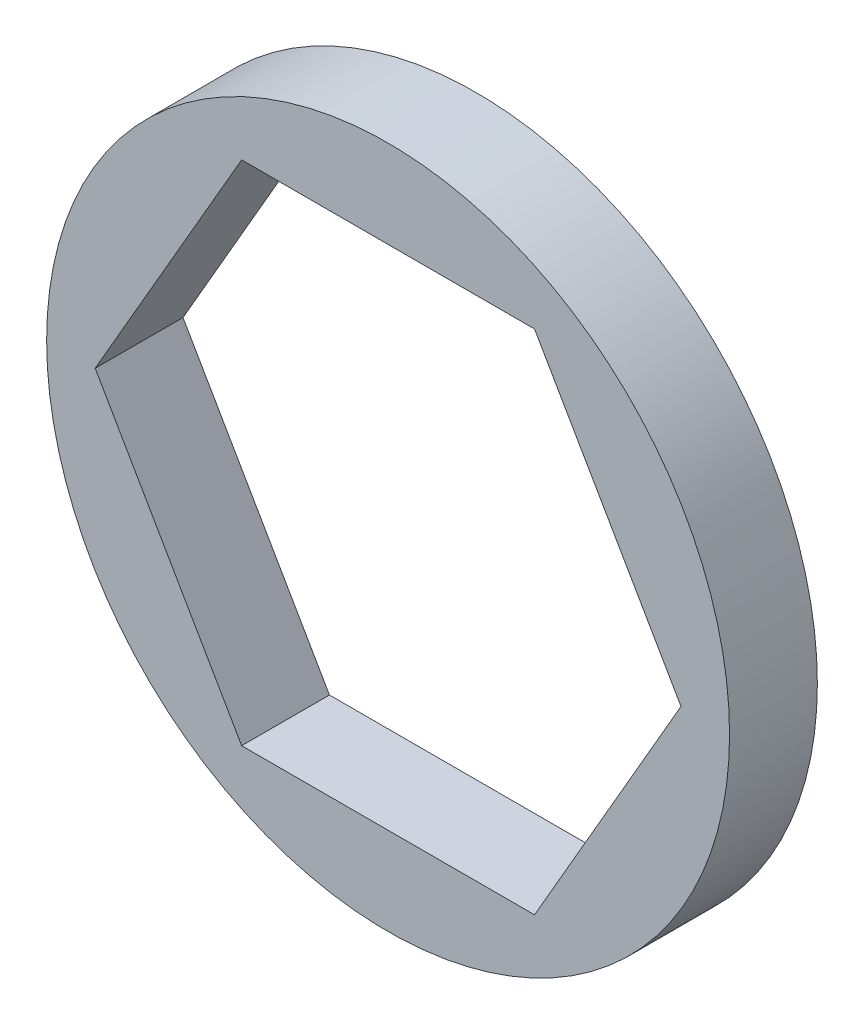
ISO-10303-21;
HEADER;
FILE_DESCRIPTION(('STEP AP214'),'2;1');
FILE_NAME('part.step','',(''),(''),'','','');
FILE_SCHEMA(('AUTOMOTIVE_DESIGN { 1 0 10303 214 1 1 1 1 }'));
ENDSEC;
DATA;
#1=APPLICATION_CONTEXT('core data for automotive mechanical design processes');
#2=APPLICATION_PROTOCOL_DEFINITION('international standard','automotive_design',2000,#1);
#3=PRODUCT_CONTEXT('',#1,'mechanical');
#4=PRODUCT('Part','Part','',(#3));
#5=PRODUCT_RELATED_PRODUCT_CATEGORY('part','',(#4));
#6=PRODUCT_DEFINITION_FORMATION('','',#4);
#7=PRODUCT_DEFINITION_CONTEXT('part definition',#1,'design');
#8=PRODUCT_DEFINITION('design','',#6,#7);
#9=PRODUCT_DEFINITION_SHAPE('','',#8);
#10=(LENGTH_UNIT() NAMED_UNIT(*) SI_UNIT(.MILLI.,.METRE.));
#11=(NAMED_UNIT(*) PLANE_ANGLE_UNIT() SI_UNIT($,.RADIAN.));
#12=(NAMED_UNIT(*) SI_UNIT($,.STERADIAN.) SOLID_ANGLE_UNIT());
#13=UNCERTAINTY_MEASURE_WITH_UNIT(LENGTH_MEASURE(1.E-05),#10,'distance_accuracy_value','');
#14=(GEOMETRIC_REPRESENTATION_CONTEXT(3) GLOBAL_UNCERTAINTY_ASSIGNED_CONTEXT((#13)) GLOBAL_UNIT_ASSIGNED_CONTEXT((#10,
#11,#12)) REPRESENTATION_CONTEXT('',''));
#15=CARTESIAN_POINT('',(0.,0.,0.));
#16=DIRECTION('',(0.,0.,1.));
#17=DIRECTION('',(1.,0.,0.));
#18=AXIS2_PLACEMENT_3D('',#15,#16,#17);
#19=CARTESIAN_POINT('',(0.,0.,2.286));
#20=DIRECTION('',(0.,0.,1.));
#21=DIRECTION('',(1.,0.,0.));
#22=AXIS2_PLACEMENT_3D('',#19,#20,#21);
#23=PLANE('',#22);
#24=CARTESIAN_POINT('',(0.,0.,2.286));
#25=DIRECTION('',(0.,0.,1.));
#26=DIRECTION('',(1.,0.,0.));
#27=AXIS2_PLACEMENT_3D('',#24,#25,#26);
#28=CIRCLE('',#27,8.89);
#29=CARTESIAN_POINT('',(8.89,0.,2.286));
#30=VERTEX_POINT('',#29);
#31=EDGE_CURVE('E11',#30,#30,#28,.T.);
#32=ORIENTED_EDGE('',*,*,#31,.T.);
#33=EDGE_LOOP('',(#32));
#34=FACE_BOUND('',#33,.T.);
#35=DIRECTION('',(-0.5,0.866025403784439,0.));
#36=VECTOR('',#35,1.);
#37=CARTESIAN_POINT('',(7.62564235545658,0.,2.286));
#38=LINE('',#37,#36);
#39=CARTESIAN_POINT('',(7.62564235545658,0.,2.286));
#40=VERTEX_POINT('',#39);
#41=CARTESIAN_POINT('',(3.81282117772829,6.604,2.286));
#42=VERTEX_POINT('',#41);
#43=EDGE_CURVE('E101',#40,#42,#38,.T.);
#44=ORIENTED_EDGE('',*,*,#43,.F.);
#45=DIRECTION('',(0.5,0.866025403784439,0.));
#46=VECTOR('',#45,1.);
#47=CARTESIAN_POINT('',(3.81282117772829,-6.604,2.286));
#48=LINE('',#47,#46);
#49=CARTESIAN_POINT('',(3.81282117772829,-6.604,2.286));
#50=VERTEX_POINT('',#49);
#51=EDGE_CURVE('E93',#50,#40,#48,.T.);
#52=ORIENTED_EDGE('',*,*,#51,.F.);
#53=DIRECTION('',(1.,0.,0.));
#54=VECTOR('',#53,1.);
#55=CARTESIAN_POINT('',(-3.81282117772829,-6.604,2.286));
#56=LINE('',#55,#54);
#57=CARTESIAN_POINT('',(-3.81282117772829,-6.604,2.286));
#58=VERTEX_POINT('',#57);
#59=EDGE_CURVE('E121',#58,#50,#56,.T.);
#60=ORIENTED_EDGE('',*,*,#59,.F.);
#61=DIRECTION('',(0.5,-0.866025403784439,0.));
#62=VECTOR('',#61,1.);
#63=CARTESIAN_POINT('',(-7.62564235545658,0.,2.286));
#64=LINE('',#63,#62);
#65=CARTESIAN_POINT('',(-7.62564235545658,0.,2.286));
#66=VERTEX_POINT('',#65);
#67=EDGE_CURVE('E119',#66,#58,#64,.T.);
#68=ORIENTED_EDGE('',*,*,#67,.F.);
#69=DIRECTION('',(-0.5,-0.866025403784439,0.));
#70=VECTOR('',#69,1.);
#71=CARTESIAN_POINT('',(-3.81282117772829,6.604,2.286));
#72=LINE('',#71,#70);
#73=CARTESIAN_POINT('',(-3.81282117772829,6.604,2.286));
#74=VERTEX_POINT('',#73);
#75=EDGE_CURVE('E115',#74,#66,#72,.T.);
#76=ORIENTED_EDGE('',*,*,#75,.F.);
#77=DIRECTION('',(-1.,0.,0.));
#78=VECTOR('',#77,1.);
#79=CARTESIAN_POINT('',(3.81282117772829,6.604,2.286));
#80=LINE('',#79,#78);
#81=EDGE_CURVE('E113',#42,#74,#80,.T.);
#82=ORIENTED_EDGE('',*,*,#81,.F.);
#83=EDGE_LOOP('',(#44,#52,#60,#68,#76,#82));
#84=FACE_BOUND('',#83,.T.);
#85=ADVANCED_FACE('F40',(#34,#84),#23,.T.);
#86=CARTESIAN_POINT('',(0.,0.,0.));
#87=DIRECTION('',(0.,0.,1.));
#88=DIRECTION('',(1.,0.,0.));
#89=AXIS2_PLACEMENT_3D('',#86,#87,#88);
#90=PLANE('',#89);
#91=CARTESIAN_POINT('',(0.,0.,0.));
#92=DIRECTION('',(0.,0.,1.));
#93=DIRECTION('',(1.,0.,0.));
#94=AXIS2_PLACEMENT_3D('',#91,#92,#93);
#95=CIRCLE('',#94,8.89);
#96=CARTESIAN_POINT('',(8.89,0.,0.));
#97=VERTEX_POINT('',#96);
#98=EDGE_CURVE('E44',#97,#97,#95,.T.);
#99=ORIENTED_EDGE('',*,*,#98,.F.);
#100=EDGE_LOOP('',(#99));
#101=FACE_BOUND('',#100,.T.);
#102=DIRECTION('',(0.5,0.866025403784439,0.));
#103=VECTOR('',#102,1.);
#104=CARTESIAN_POINT('',(3.81282117772829,-6.604,0.));
#105=LINE('',#104,#103);
#106=CARTESIAN_POINT('',(3.81282117772829,-6.604,0.));
#107=VERTEX_POINT('',#106);
#108=CARTESIAN_POINT('',(7.62564235545658,0.,0.));
#109=VERTEX_POINT('',#108);
#110=EDGE_CURVE('E63',#107,#109,#105,.T.);
#111=ORIENTED_EDGE('',*,*,#110,.T.);
#112=DIRECTION('',(-0.5,0.866025403784439,0.));
#113=VECTOR('',#112,1.);
#114=CARTESIAN_POINT('',(7.62564235545658,0.,0.));
#115=LINE('',#114,#113);
#116=CARTESIAN_POINT('',(3.81282117772829,6.604,0.));
#117=VERTEX_POINT('',#116);
#118=EDGE_CURVE('E108',#109,#117,#115,.T.);
#119=ORIENTED_EDGE('',*,*,#118,.T.);
#120=DIRECTION('',(-1.,0.,0.));
#121=VECTOR('',#120,1.);
#122=CARTESIAN_POINT('',(3.81282117772829,6.604,0.));
#123=LINE('',#122,#121);
#124=CARTESIAN_POINT('',(-3.81282117772829,6.604,0.));
#125=VERTEX_POINT('',#124);
#126=EDGE_CURVE('E125',#117,#125,#123,.T.);
#127=ORIENTED_EDGE('',*,*,#126,.T.);
#128=DIRECTION('',(-0.5,-0.866025403784439,0.));
#129=VECTOR('',#128,1.);
#130=CARTESIAN_POINT('',(-3.81282117772829,6.604,0.));
#131=LINE('',#130,#129);
#132=CARTESIAN_POINT('',(-7.62564235545658,0.,0.));
#133=VERTEX_POINT('',#132);
#134=EDGE_CURVE('E128',#125,#133,#131,.T.);
#135=ORIENTED_EDGE('',*,*,#134,.T.);
#136=DIRECTION('',(0.5,-0.866025403784439,0.));
#137=VECTOR('',#136,1.);
#138=CARTESIAN_POINT('',(-7.62564235545658,0.,0.));
#139=LINE('',#138,#137);
#140=CARTESIAN_POINT('',(-3.81282117772829,-6.604,0.));
#141=VERTEX_POINT('',#140);
#142=EDGE_CURVE('E131',#133,#141,#139,.T.);
#143=ORIENTED_EDGE('',*,*,#142,.T.);
#144=DIRECTION('',(1.,0.,0.));
#145=VECTOR('',#144,1.);
#146=CARTESIAN_POINT('',(-3.81282117772829,-6.604,0.));
#147=LINE('',#146,#145);
#148=EDGE_CURVE('E102',#141,#107,#147,.T.);
#149=ORIENTED_EDGE('',*,*,#148,.T.);
#150=EDGE_LOOP('',(#111,#119,#127,#135,#143,#149));
#151=FACE_BOUND('',#150,.T.);
#152=ADVANCED_FACE('F148',(#101,#151),#90,.F.);
#153=CARTESIAN_POINT('',(0.,0.,2.286));
#154=DIRECTION('',(0.,0.,-1.));
#155=DIRECTION('',(-1.,0.,0.));
#156=AXIS2_PLACEMENT_3D('',#153,#154,#155);
#157=CYLINDRICAL_SURFACE('',#156,8.89);
#158=ORIENTED_EDGE('',*,*,#31,.F.);
#159=EDGE_LOOP('',(#158));
#160=FACE_BOUND('',#159,.T.);
#161=ORIENTED_EDGE('',*,*,#98,.T.);
#162=EDGE_LOOP('',(#161));
#163=FACE_BOUND('',#162,.T.);
#164=ADVANCED_FACE('F42',(#160,#163),#157,.T.);
#165=CARTESIAN_POINT('',(3.81282117772829,-6.604,2.286));
#166=DIRECTION('',(-0.866025403784439,0.5,0.));
#167=DIRECTION('',(-0.5,-0.866025403784439,0.));
#168=AXIS2_PLACEMENT_3D('',#165,#166,#167);
#169=PLANE('',#168);
#170=ORIENTED_EDGE('',*,*,#110,.F.);
#171=DIRECTION('',(0.,0.,-1.));
#172=VECTOR('',#171,1.);
#173=CARTESIAN_POINT('',(3.81282117772829,-6.604,2.286));
#174=LINE('',#173,#172);
#175=EDGE_CURVE('E97',#50,#107,#174,.T.);
#176=ORIENTED_EDGE('',*,*,#175,.F.);
#177=ORIENTED_EDGE('',*,*,#51,.T.);
#178=DIRECTION('',(0.,0.,-1.));
#179=VECTOR('',#178,1.);
#180=CARTESIAN_POINT('',(7.62564235545658,0.,2.286));
#181=LINE('',#180,#179);
#182=EDGE_CURVE('E96',#40,#109,#181,.T.);
#183=ORIENTED_EDGE('',*,*,#182,.T.);
#184=EDGE_LOOP('',(#170,#176,#177,#183));
#185=FACE_BOUND('',#184,.T.);
#186=ADVANCED_FACE('F95',(#185),#169,.T.);
#187=CARTESIAN_POINT('',(7.62564235545658,0.,2.286));
#188=DIRECTION('',(-0.866025403784438,-0.5,0.));
#189=DIRECTION('',(0.5,-0.866025403784439,0.));
#190=AXIS2_PLACEMENT_3D('',#187,#188,#189);
#191=PLANE('',#190);
#192=ORIENTED_EDGE('',*,*,#118,.F.);
#193=ORIENTED_EDGE('',*,*,#182,.F.);
#194=ORIENTED_EDGE('',*,*,#43,.T.);
#195=DIRECTION('',(0.,0.,-1.));
#196=VECTOR('',#195,1.);
#197=CARTESIAN_POINT('',(3.81282117772829,6.604,2.286));
#198=LINE('',#197,#196);
#199=EDGE_CURVE('E109',#42,#117,#198,.T.);
#200=ORIENTED_EDGE('',*,*,#199,.T.);
#201=EDGE_LOOP('',(#192,#193,#194,#200));
#202=FACE_BOUND('',#201,.T.);
#203=ADVANCED_FACE('F105',(#202),#191,.T.);
#204=CARTESIAN_POINT('',(3.81282117772829,6.604,2.286));
#205=DIRECTION('',(0.,-1.,0.));
#206=DIRECTION('',(1.,0.,0.));
#207=AXIS2_PLACEMENT_3D('',#204,#205,#206);
#208=PLANE('',#207);
#209=ORIENTED_EDGE('',*,*,#126,.F.);
#210=ORIENTED_EDGE('',*,*,#199,.F.);
#211=ORIENTED_EDGE('',*,*,#81,.T.);
#212=DIRECTION('',(0.,0.,-1.));
#213=VECTOR('',#212,1.);
#214=CARTESIAN_POINT('',(-3.81282117772829,6.604,2.286));
#215=LINE('',#214,#213);
#216=EDGE_CURVE('E140',#74,#125,#215,.T.);
#217=ORIENTED_EDGE('',*,*,#216,.T.);
#218=EDGE_LOOP('',(#209,#210,#211,#217));
#219=FACE_BOUND('',#218,.T.);
#220=ADVANCED_FACE('F144',(#219),#208,.T.);
#221=CARTESIAN_POINT('',(-3.81282117772829,6.604,2.286));
#222=DIRECTION('',(0.866025403784439,-0.5,0.));
#223=DIRECTION('',(0.5,0.866025403784439,0.));
#224=AXIS2_PLACEMENT_3D('',#221,#222,#223);
#225=PLANE('',#224);
#226=ORIENTED_EDGE('',*,*,#134,.F.);
#227=ORIENTED_EDGE('',*,*,#216,.F.);
#228=ORIENTED_EDGE('',*,*,#75,.T.);
#229=DIRECTION('',(0.,0.,-1.));
#230=VECTOR('',#229,1.);
#231=CARTESIAN_POINT('',(-7.62564235545658,0.,2.286));
#232=LINE('',#231,#230);
#233=EDGE_CURVE('E138',#66,#133,#232,.T.);
#234=ORIENTED_EDGE('',*,*,#233,.T.);
#235=EDGE_LOOP('',(#226,#227,#228,#234));
#236=FACE_BOUND('',#235,.T.);
#237=ADVANCED_FACE('F156',(#236),#225,.T.);
#238=CARTESIAN_POINT('',(-7.62564235545658,0.,2.286));
#239=DIRECTION('',(0.866025403784438,0.5,0.));
#240=DIRECTION('',(-0.5,0.866025403784439,0.));
#241=AXIS2_PLACEMENT_3D('',#238,#239,#240);
#242=PLANE('',#241);
#243=ORIENTED_EDGE('',*,*,#142,.F.);
#244=ORIENTED_EDGE('',*,*,#233,.F.);
#245=ORIENTED_EDGE('',*,*,#67,.T.);
#246=DIRECTION('',(0.,0.,-1.));
#247=VECTOR('',#246,1.);
#248=CARTESIAN_POINT('',(-3.81282117772829,-6.604,2.286));
#249=LINE('',#248,#247);
#250=EDGE_CURVE('E55',#58,#141,#249,.T.);
#251=ORIENTED_EDGE('',*,*,#250,.T.);
#252=EDGE_LOOP('',(#243,#244,#245,#251));
#253=FACE_BOUND('',#252,.T.);
#254=ADVANCED_FACE('F154',(#253),#242,.T.);
#255=CARTESIAN_POINT('',(-3.81282117772829,-6.604,2.286));
#256=DIRECTION('',(0.,1.,0.));
#257=DIRECTION('',(0.,0.,1.));
#258=AXIS2_PLACEMENT_3D('',#255,#256,#257);
#259=PLANE('',#258);
#260=ORIENTED_EDGE('',*,*,#148,.F.);
#261=ORIENTED_EDGE('',*,*,#250,.F.);
#262=ORIENTED_EDGE('',*,*,#59,.T.);
#263=ORIENTED_EDGE('',*,*,#175,.T.);
#264=EDGE_LOOP('',(#260,#261,#262,#263));
#265=FACE_BOUND('',#264,.T.);
#266=ADVANCED_FACE('F150',(#265),#259,.T.);
#267=CLOSED_SHELL('',(#85,#152,#164,#186,#203,#220,#237,#254,#266));
#268=MANIFOLD_SOLID_BREP('B2',#267);
#269=ADVANCED_BREP_SHAPE_REPRESENTATION('',(#18,#268),#14);
#270=SHAPE_DEFINITION_REPRESENTATION(#9,#269);
ENDSEC;
END-ISO-10303-21;
